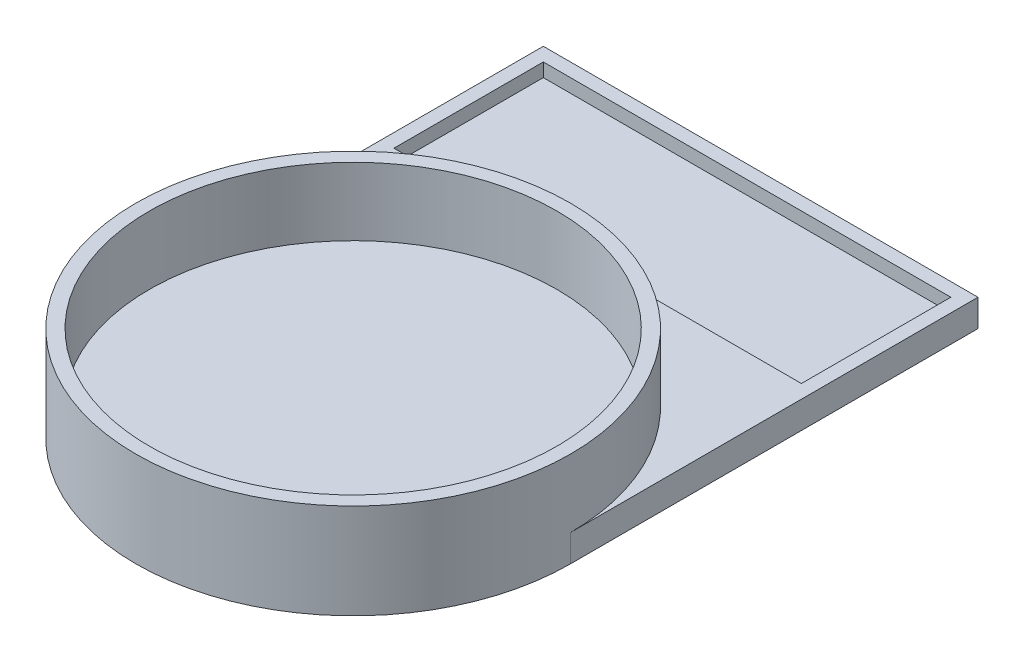
ISO-10303-21;
HEADER;
FILE_DESCRIPTION(('STEP AP214'),'2;1');
FILE_NAME('part.step','',(''),(''),'','','');
FILE_SCHEMA(('AUTOMOTIVE_DESIGN { 1 0 10303 214 1 1 1 1 }'));
ENDSEC;
DATA;
#1=APPLICATION_CONTEXT('core data for automotive mechanical design processes');
#2=APPLICATION_PROTOCOL_DEFINITION('international standard','automotive_design',2000,#1);
#3=PRODUCT_CONTEXT('',#1,'mechanical');
#4=PRODUCT('Part','Part','',(#3));
#5=PRODUCT_RELATED_PRODUCT_CATEGORY('part','',(#4));
#6=PRODUCT_DEFINITION_FORMATION('','',#4);
#7=PRODUCT_DEFINITION_CONTEXT('part definition',#1,'design');
#8=PRODUCT_DEFINITION('design','',#6,#7);
#9=PRODUCT_DEFINITION_SHAPE('','',#8);
#10=(LENGTH_UNIT() NAMED_UNIT(*) SI_UNIT(.MILLI.,.METRE.));
#11=(NAMED_UNIT(*) PLANE_ANGLE_UNIT() SI_UNIT($,.RADIAN.));
#12=(NAMED_UNIT(*) SI_UNIT($,.STERADIAN.) SOLID_ANGLE_UNIT());
#13=UNCERTAINTY_MEASURE_WITH_UNIT(LENGTH_MEASURE(1.E-05),#10,'distance_accuracy_value','');
#14=(GEOMETRIC_REPRESENTATION_CONTEXT(3) GLOBAL_UNCERTAINTY_ASSIGNED_CONTEXT((#13)) GLOBAL_UNIT_ASSIGNED_CONTEXT((#10,
#11,#12)) REPRESENTATION_CONTEXT('',''));
#15=CARTESIAN_POINT('',(0.,0.,0.));
#16=DIRECTION('',(0.,0.,1.));
#17=DIRECTION('',(1.,0.,0.));
#18=AXIS2_PLACEMENT_3D('',#15,#16,#17);
#19=CARTESIAN_POINT('',(0.,0.,0.));
#20=DIRECTION('',(0.,1.,0.));
#21=DIRECTION('',(0.,0.,1.));
#22=AXIS2_PLACEMENT_3D('',#19,#20,#21);
#23=PLANE('',#22);
#24=CARTESIAN_POINT('',(0.,0.,0.));
#25=DIRECTION('',(0.,-1.,0.));
#26=DIRECTION('',(0.,0.,-1.));
#27=AXIS2_PLACEMENT_3D('',#24,#25,#26);
#28=CIRCLE('',#27,15.);
#29=CARTESIAN_POINT('',(0.,0.,-15.));
#30=VERTEX_POINT('',#29);
#31=EDGE_CURVE('E20',#30,#30,#28,.F.);
#32=ORIENTED_EDGE('',*,*,#31,.T.);
#33=EDGE_LOOP('',(#32));
#34=FACE_BOUND('',#33,.T.);
#35=ADVANCED_FACE('F17',(#34),#23,.T.);
#36=CARTESIAN_POINT('',(15.,-1.,-29.));
#37=DIRECTION('',(0.,1.,0.));
#38=DIRECTION('',(0.,0.,1.));
#39=AXIS2_PLACEMENT_3D('',#36,#37,#38);
#40=PLANE('',#39);
#41=DIRECTION('',(0.,0.,1.));
#42=VECTOR('',#41,1.);
#43=CARTESIAN_POINT('',(-15.,-1.,-29.));
#44=LINE('',#43,#42);
#45=CARTESIAN_POINT('',(-15.,-1.,-29.));
#46=VERTEX_POINT('',#45);
#47=CARTESIAN_POINT('',(-15.,-1.,-18.));
#48=VERTEX_POINT('',#47);
#49=EDGE_CURVE('E98',#46,#48,#44,.T.);
#50=ORIENTED_EDGE('',*,*,#49,.T.);
#51=DIRECTION('',(1.,0.,0.));
#52=VECTOR('',#51,1.);
#53=CARTESIAN_POINT('',(-15.,-1.,-18.));
#54=LINE('',#53,#52);
#55=CARTESIAN_POINT('',(15.,-1.,-18.));
#56=VERTEX_POINT('',#55);
#57=EDGE_CURVE('E77',#48,#56,#54,.T.);
#58=ORIENTED_EDGE('',*,*,#57,.T.);
#59=DIRECTION('',(0.,0.,-1.));
#60=VECTOR('',#59,1.);
#61=CARTESIAN_POINT('',(15.,-1.,-18.));
#62=LINE('',#61,#60);
#63=CARTESIAN_POINT('',(15.,-1.,-29.));
#64=VERTEX_POINT('',#63);
#65=EDGE_CURVE('E83',#56,#64,#62,.T.);
#66=ORIENTED_EDGE('',*,*,#65,.T.);
#67=DIRECTION('',(-1.,0.,0.));
#68=VECTOR('',#67,1.);
#69=CARTESIAN_POINT('',(15.,-1.,-29.));
#70=LINE('',#69,#68);
#71=EDGE_CURVE('E121',#64,#46,#70,.T.);
#72=ORIENTED_EDGE('',*,*,#71,.T.);
#73=EDGE_LOOP('',(#50,#58,#66,#72));
#74=FACE_BOUND('',#73,.T.);
#75=ADVANCED_FACE('F101',(#74),#40,.T.);
#76=CARTESIAN_POINT('',(0.,5.,0.));
#77=DIRECTION('',(0.,-1.,0.));
#78=DIRECTION('',(0.,0.,-1.));
#79=AXIS2_PLACEMENT_3D('',#76,#77,#78);
#80=CYLINDRICAL_SURFACE('',#79,15.);
#81=CARTESIAN_POINT('',(0.,5.,0.));
#82=DIRECTION('',(0.,-1.,0.));
#83=DIRECTION('',(0.,0.,-1.));
#84=AXIS2_PLACEMENT_3D('',#81,#82,#83);
#85=CIRCLE('',#84,15.);
#86=CARTESIAN_POINT('',(0.,5.,-15.));
#87=VERTEX_POINT('',#86);
#88=EDGE_CURVE('E112',#87,#87,#85,.T.);
#89=ORIENTED_EDGE('',*,*,#88,.F.);
#90=EDGE_LOOP('',(#89));
#91=FACE_BOUND('',#90,.T.);
#92=ORIENTED_EDGE('',*,*,#31,.F.);
#93=EDGE_LOOP('',(#92));
#94=FACE_BOUND('',#93,.T.);
#95=ADVANCED_FACE('F267',(#91,#94),#80,.F.);
#96=CARTESIAN_POINT('',(15.,-1.,-18.));
#97=DIRECTION('',(1.,0.,0.));
#98=DIRECTION('',(0.,0.,-1.));
#99=AXIS2_PLACEMENT_3D('',#96,#97,#98);
#100=PLANE('',#99);
#101=DIRECTION('',(0.,1.,0.));
#102=VECTOR('',#101,1.);
#103=CARTESIAN_POINT('',(15.,-1.,-29.));
#104=LINE('',#103,#102);
#105=CARTESIAN_POINT('',(15.,0.,-29.));
#106=VERTEX_POINT('',#105);
#107=EDGE_CURVE('E90',#106,#64,#104,.F.);
#108=ORIENTED_EDGE('',*,*,#107,.T.);
#109=ORIENTED_EDGE('',*,*,#65,.F.);
#110=DIRECTION('',(0.,1.,0.));
#111=VECTOR('',#110,1.);
#112=CARTESIAN_POINT('',(15.,-1.,-18.));
#113=LINE('',#112,#111);
#114=CARTESIAN_POINT('',(15.,0.,-18.));
#115=VERTEX_POINT('',#114);
#116=EDGE_CURVE('E87',#56,#115,#113,.T.);
#117=ORIENTED_EDGE('',*,*,#116,.T.);
#118=DIRECTION('',(0.,0.,1.));
#119=VECTOR('',#118,1.);
#120=CARTESIAN_POINT('',(15.,0.,0.));
#121=LINE('',#120,#119);
#122=EDGE_CURVE('E114',#106,#115,#121,.T.);
#123=ORIENTED_EDGE('',*,*,#122,.F.);
#124=EDGE_LOOP('',(#108,#109,#117,#123));
#125=FACE_BOUND('',#124,.T.);
#126=ADVANCED_FACE('F84',(#125),#100,.F.);
#127=CARTESIAN_POINT('',(-15.,-1.,-18.));
#128=DIRECTION('',(0.,0.,1.));
#129=DIRECTION('',(1.,0.,0.));
#130=AXIS2_PLACEMENT_3D('',#127,#128,#129);
#131=PLANE('',#130);
#132=ORIENTED_EDGE('',*,*,#116,.F.);
#133=ORIENTED_EDGE('',*,*,#57,.F.);
#134=DIRECTION('',(0.,1.,0.));
#135=VECTOR('',#134,1.);
#136=CARTESIAN_POINT('',(-15.,-1.,-18.));
#137=LINE('',#136,#135);
#138=CARTESIAN_POINT('',(-15.,0.,-18.));
#139=VERTEX_POINT('',#138);
#140=EDGE_CURVE('E134',#48,#139,#137,.T.);
#141=ORIENTED_EDGE('',*,*,#140,.T.);
#142=DIRECTION('',(1.,0.,0.));
#143=VECTOR('',#142,1.);
#144=CARTESIAN_POINT('',(0.,0.,-18.));
#145=LINE('',#144,#143);
#146=EDGE_CURVE('E97',#115,#139,#145,.F.);
#147=ORIENTED_EDGE('',*,*,#146,.F.);
#148=EDGE_LOOP('',(#132,#133,#141,#147));
#149=FACE_BOUND('',#148,.T.);
#150=ADVANCED_FACE('F95',(#149),#131,.F.);
#151=CARTESIAN_POINT('',(-15.,-1.,-29.));
#152=DIRECTION('',(-1.,0.,0.));
#153=DIRECTION('',(0.,0.,1.));
#154=AXIS2_PLACEMENT_3D('',#151,#152,#153);
#155=PLANE('',#154);
#156=ORIENTED_EDGE('',*,*,#140,.F.);
#157=ORIENTED_EDGE('',*,*,#49,.F.);
#158=DIRECTION('',(0.,1.,0.));
#159=VECTOR('',#158,1.);
#160=CARTESIAN_POINT('',(-15.,-1.,-29.));
#161=LINE('',#160,#159);
#162=CARTESIAN_POINT('',(-15.,0.,-29.));
#163=VERTEX_POINT('',#162);
#164=EDGE_CURVE('E115',#46,#163,#161,.T.);
#165=ORIENTED_EDGE('',*,*,#164,.T.);
#166=DIRECTION('',(0.,0.,1.));
#167=VECTOR('',#166,1.);
#168=CARTESIAN_POINT('',(-15.,0.,0.));
#169=LINE('',#168,#167);
#170=EDGE_CURVE('E138',#139,#163,#169,.F.);
#171=ORIENTED_EDGE('',*,*,#170,.F.);
#172=EDGE_LOOP('',(#156,#157,#165,#171));
#173=FACE_BOUND('',#172,.T.);
#174=ADVANCED_FACE('F139',(#173),#155,.F.);
#175=CARTESIAN_POINT('',(15.,-1.,-29.));
#176=DIRECTION('',(0.,0.,-1.));
#177=DIRECTION('',(-1.,0.,0.));
#178=AXIS2_PLACEMENT_3D('',#175,#176,#177);
#179=PLANE('',#178);
#180=ORIENTED_EDGE('',*,*,#164,.F.);
#181=ORIENTED_EDGE('',*,*,#71,.F.);
#182=ORIENTED_EDGE('',*,*,#107,.F.);
#183=DIRECTION('',(1.,0.,0.));
#184=VECTOR('',#183,1.);
#185=CARTESIAN_POINT('',(0.,0.,-29.));
#186=LINE('',#185,#184);
#187=EDGE_CURVE('E142',#163,#106,#186,.T.);
#188=ORIENTED_EDGE('',*,*,#187,.F.);
#189=EDGE_LOOP('',(#180,#181,#182,#188));
#190=FACE_BOUND('',#189,.T.);
#191=ADVANCED_FACE('F193',(#190),#179,.F.);
#192=CARTESIAN_POINT('',(0.,5.,0.));
#193=DIRECTION('',(0.,1.,0.));
#194=DIRECTION('',(0.,0.,1.));
#195=AXIS2_PLACEMENT_3D('',#192,#193,#194);
#196=PLANE('',#195);
#197=ORIENTED_EDGE('',*,*,#88,.T.);
#198=EDGE_LOOP('',(#197));
#199=FACE_BOUND('',#198,.T.);
#200=CARTESIAN_POINT('',(0.,5.,0.));
#201=DIRECTION('',(0.,-1.,0.));
#202=DIRECTION('',(0.,0.,-1.));
#203=AXIS2_PLACEMENT_3D('',#200,#201,#202);
#204=CIRCLE('',#203,16.);
#205=CARTESIAN_POINT('',(0.,5.,-16.));
#206=VERTEX_POINT('',#205);
#207=EDGE_CURVE('E109',#206,#206,#204,.T.);
#208=ORIENTED_EDGE('',*,*,#207,.F.);
#209=EDGE_LOOP('',(#208));
#210=FACE_BOUND('',#209,.T.);
#211=ADVANCED_FACE('F195',(#199,#210),#196,.T.);
#212=CARTESIAN_POINT('',(0.,0.,0.));
#213=DIRECTION('',(0.,1.,0.));
#214=DIRECTION('',(0.,0.,1.));
#215=AXIS2_PLACEMENT_3D('',#212,#213,#214);
#216=PLANE('',#215);
#217=DIRECTION('',(0.,0.,1.));
#218=VECTOR('',#217,1.);
#219=CARTESIAN_POINT('',(-16.,0.,0.));
#220=LINE('',#219,#218);
#221=CARTESIAN_POINT('',(-16.,0.,0.));
#222=VERTEX_POINT('',#221);
#223=CARTESIAN_POINT('',(-16.,0.,-30.));
#224=VERTEX_POINT('',#223);
#225=EDGE_CURVE('E59',#222,#224,#220,.F.);
#226=ORIENTED_EDGE('',*,*,#225,.F.);
#227=CARTESIAN_POINT('',(0.,0.,0.));
#228=DIRECTION('',(0.,-1.,0.));
#229=DIRECTION('',(0.,0.,-1.));
#230=AXIS2_PLACEMENT_3D('',#227,#228,#229);
#231=CIRCLE('',#230,16.);
#232=CARTESIAN_POINT('',(16.,0.,0.));
#233=VERTEX_POINT('',#232);
#234=EDGE_CURVE('E52',#233,#222,#231,.F.);
#235=ORIENTED_EDGE('',*,*,#234,.F.);
#236=DIRECTION('',(0.,0.,-1.));
#237=VECTOR('',#236,1.);
#238=CARTESIAN_POINT('',(16.,0.,0.));
#239=LINE('',#238,#237);
#240=CARTESIAN_POINT('',(16.,0.,-30.));
#241=VERTEX_POINT('',#240);
#242=EDGE_CURVE('E144',#241,#233,#239,.F.);
#243=ORIENTED_EDGE('',*,*,#242,.F.);
#244=DIRECTION('',(-1.,0.,0.));
#245=VECTOR('',#244,1.);
#246=CARTESIAN_POINT('',(-16.,0.,-30.));
#247=LINE('',#246,#245);
#248=EDGE_CURVE('E149',#224,#241,#247,.F.);
#249=ORIENTED_EDGE('',*,*,#248,.F.);
#250=EDGE_LOOP('',(#226,#235,#243,#249));
#251=FACE_BOUND('',#250,.T.);
#252=ORIENTED_EDGE('',*,*,#170,.T.);
#253=ORIENTED_EDGE('',*,*,#187,.T.);
#254=ORIENTED_EDGE('',*,*,#122,.T.);
#255=ORIENTED_EDGE('',*,*,#146,.T.);
#256=EDGE_LOOP('',(#252,#253,#254,#255));
#257=FACE_BOUND('',#256,.T.);
#258=ADVANCED_FACE('F188',(#251,#257),#216,.T.);
#259=CARTESIAN_POINT('',(16.,-2.,0.));
#260=DIRECTION('',(1.,0.,0.));
#261=DIRECTION('',(0.,0.,-1.));
#262=AXIS2_PLACEMENT_3D('',#259,#260,#261);
#263=PLANE('',#262);
#264=DIRECTION('',(0.,0.,1.));
#265=VECTOR('',#264,1.);
#266=CARTESIAN_POINT('',(16.,-2.,0.));
#267=LINE('',#266,#265);
#268=CARTESIAN_POINT('',(16.,-2.,0.));
#269=VERTEX_POINT('',#268);
#270=CARTESIAN_POINT('',(16.,-2.,-30.));
#271=VERTEX_POINT('',#270);
#272=EDGE_CURVE('E106',#269,#271,#267,.F.);
#273=ORIENTED_EDGE('',*,*,#272,.T.);
#274=DIRECTION('',(0.,1.,0.));
#275=VECTOR('',#274,1.);
#276=CARTESIAN_POINT('',(16.,-2.,-30.));
#277=LINE('',#276,#275);
#278=EDGE_CURVE('E151',#241,#271,#277,.F.);
#279=ORIENTED_EDGE('',*,*,#278,.F.);
#280=ORIENTED_EDGE('',*,*,#242,.T.);
#281=DIRECTION('',(0.,1.,0.));
#282=VECTOR('',#281,1.);
#283=CARTESIAN_POINT('',(16.,-2.,0.));
#284=LINE('',#283,#282);
#285=EDGE_CURVE('E152',#233,#269,#284,.F.);
#286=ORIENTED_EDGE('',*,*,#285,.T.);
#287=EDGE_LOOP('',(#273,#279,#280,#286));
#288=FACE_BOUND('',#287,.T.);
#289=ADVANCED_FACE('F181',(#288),#263,.T.);
#290=CARTESIAN_POINT('',(-16.,-2.,-30.));
#291=DIRECTION('',(0.,0.,-1.));
#292=DIRECTION('',(-1.,0.,0.));
#293=AXIS2_PLACEMENT_3D('',#290,#291,#292);
#294=PLANE('',#293);
#295=DIRECTION('',(1.,0.,0.));
#296=VECTOR('',#295,1.);
#297=CARTESIAN_POINT('',(0.,-2.,-30.));
#298=LINE('',#297,#296);
#299=CARTESIAN_POINT('',(-16.,-2.,-30.));
#300=VERTEX_POINT('',#299);
#301=EDGE_CURVE('E26',#271,#300,#298,.F.);
#302=ORIENTED_EDGE('',*,*,#301,.T.);
#303=DIRECTION('',(0.,1.,0.));
#304=VECTOR('',#303,1.);
#305=CARTESIAN_POINT('',(-16.,-2.,-30.));
#306=LINE('',#305,#304);
#307=EDGE_CURVE('E111',#224,#300,#306,.F.);
#308=ORIENTED_EDGE('',*,*,#307,.F.);
#309=ORIENTED_EDGE('',*,*,#248,.T.);
#310=ORIENTED_EDGE('',*,*,#278,.T.);
#311=EDGE_LOOP('',(#302,#308,#309,#310));
#312=FACE_BOUND('',#311,.T.);
#313=ADVANCED_FACE('F186',(#312),#294,.T.);
#314=CARTESIAN_POINT('',(-16.,-2.,0.));
#315=DIRECTION('',(-1.,0.,0.));
#316=DIRECTION('',(0.,0.,1.));
#317=AXIS2_PLACEMENT_3D('',#314,#315,#316);
#318=PLANE('',#317);
#319=DIRECTION('',(0.,0.,1.));
#320=VECTOR('',#319,1.);
#321=CARTESIAN_POINT('',(-16.,-2.,0.));
#322=LINE('',#321,#320);
#323=CARTESIAN_POINT('',(-16.,-2.,0.));
#324=VERTEX_POINT('',#323);
#325=EDGE_CURVE('E11',#300,#324,#322,.T.);
#326=ORIENTED_EDGE('',*,*,#325,.T.);
#327=DIRECTION('',(0.,-1.,0.));
#328=VECTOR('',#327,1.);
#329=CARTESIAN_POINT('',(-16.,5.,0.));
#330=LINE('',#329,#328);
#331=EDGE_CURVE('E107',#222,#324,#330,.T.);
#332=ORIENTED_EDGE('',*,*,#331,.F.);
#333=ORIENTED_EDGE('',*,*,#225,.T.);
#334=ORIENTED_EDGE('',*,*,#307,.T.);
#335=EDGE_LOOP('',(#326,#332,#333,#334));
#336=FACE_BOUND('',#335,.T.);
#337=ADVANCED_FACE('F184',(#336),#318,.T.);
#338=CARTESIAN_POINT('',(0.,5.,0.));
#339=DIRECTION('',(0.,-1.,0.));
#340=DIRECTION('',(0.,0.,-1.));
#341=AXIS2_PLACEMENT_3D('',#338,#339,#340);
#342=CYLINDRICAL_SURFACE('',#341,16.);
#343=ORIENTED_EDGE('',*,*,#207,.T.);
#344=EDGE_LOOP('',(#343));
#345=FACE_BOUND('',#344,.T.);
#346=ORIENTED_EDGE('',*,*,#331,.T.);
#347=CARTESIAN_POINT('',(0.,-2.,0.));
#348=DIRECTION('',(0.,-1.,0.));
#349=DIRECTION('',(0.,0.,-1.));
#350=AXIS2_PLACEMENT_3D('',#347,#348,#349);
#351=CIRCLE('',#350,16.);
#352=EDGE_CURVE('E35',#324,#269,#351,.F.);
#353=ORIENTED_EDGE('',*,*,#352,.T.);
#354=ORIENTED_EDGE('',*,*,#285,.F.);
#355=ORIENTED_EDGE('',*,*,#234,.T.);
#356=EDGE_LOOP('',(#346,#353,#354,#355));
#357=FACE_BOUND('',#356,.T.);
#358=ADVANCED_FACE('F183',(#345,#357),#342,.T.);
#359=CARTESIAN_POINT('',(0.,-2.,0.));
#360=DIRECTION('',(0.,1.,0.));
#361=DIRECTION('',(0.,0.,1.));
#362=AXIS2_PLACEMENT_3D('',#359,#360,#361);
#363=PLANE('',#362);
#364=ORIENTED_EDGE('',*,*,#325,.F.);
#365=ORIENTED_EDGE('',*,*,#301,.F.);
#366=ORIENTED_EDGE('',*,*,#272,.F.);
#367=ORIENTED_EDGE('',*,*,#352,.F.);
#368=EDGE_LOOP('',(#364,#365,#366,#367));
#369=FACE_BOUND('',#368,.T.);
#370=ADVANCED_FACE('F182',(#369),#363,.F.);
#371=CLOSED_SHELL('',(#35,#75,#95,#126,#150,#174,#191,#211,#258,#289,#313,#337,#358,#370));
#372=MANIFOLD_SOLID_BREP('B1',#371);
#373=ADVANCED_BREP_SHAPE_REPRESENTATION('',(#18,#372),#14);
#374=SHAPE_DEFINITION_REPRESENTATION(#9,#373);
ENDSEC;
END-ISO-10303-21;
